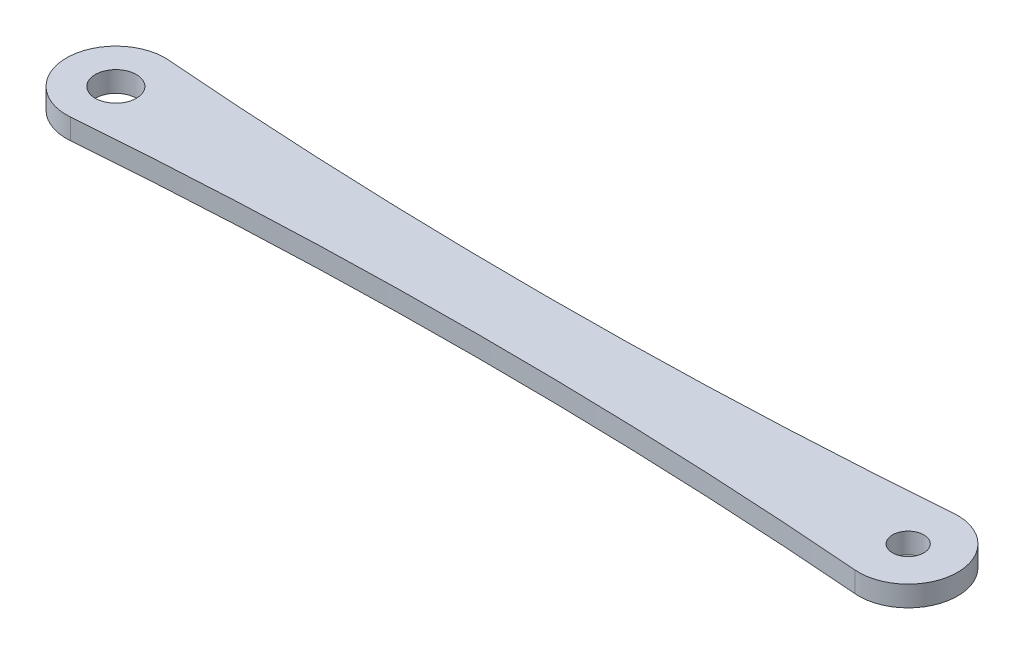
ISO-10303-21;
HEADER;
FILE_DESCRIPTION(('STEP AP214'),'2;1');
FILE_NAME('part.step','',(''),(''),'','','');
FILE_SCHEMA(('AUTOMOTIVE_DESIGN { 1 0 10303 214 1 1 1 1 }'));
ENDSEC;
DATA;
#1=APPLICATION_CONTEXT('core data for automotive mechanical design processes');
#2=APPLICATION_PROTOCOL_DEFINITION('international standard','automotive_design',2000,#1);
#3=PRODUCT_CONTEXT('',#1,'mechanical');
#4=PRODUCT('Part','Part','',(#3));
#5=PRODUCT_RELATED_PRODUCT_CATEGORY('part','',(#4));
#6=PRODUCT_DEFINITION_FORMATION('','',#4);
#7=PRODUCT_DEFINITION_CONTEXT('part definition',#1,'design');
#8=PRODUCT_DEFINITION('design','',#6,#7);
#9=PRODUCT_DEFINITION_SHAPE('','',#8);
#10=(LENGTH_UNIT() NAMED_UNIT(*) SI_UNIT(.MILLI.,.METRE.));
#11=(NAMED_UNIT(*) PLANE_ANGLE_UNIT() SI_UNIT($,.RADIAN.));
#12=(NAMED_UNIT(*) SI_UNIT($,.STERADIAN.) SOLID_ANGLE_UNIT());
#13=UNCERTAINTY_MEASURE_WITH_UNIT(LENGTH_MEASURE(1.E-05),#10,'distance_accuracy_value','');
#14=(GEOMETRIC_REPRESENTATION_CONTEXT(3) GLOBAL_UNCERTAINTY_ASSIGNED_CONTEXT((#13)) GLOBAL_UNIT_ASSIGNED_CONTEXT((#10,
#11,#12)) REPRESENTATION_CONTEXT('',''));
#15=CARTESIAN_POINT('',(0.,0.,0.));
#16=DIRECTION('',(0.,0.,1.));
#17=DIRECTION('',(1.,0.,0.));
#18=AXIS2_PLACEMENT_3D('',#15,#16,#17);
#19=CARTESIAN_POINT('',(122.28780978,3.175,0.));
#20=DIRECTION('',(0.,-1.,0.));
#21=DIRECTION('',(0.,0.,-1.));
#22=AXIS2_PLACEMENT_3D('',#19,#20,#21);
#23=CYLINDRICAL_SURFACE('',#22,7.62000000000001);
#24=CARTESIAN_POINT('',(122.28780978,0.,0.));
#25=DIRECTION('',(0.,1.,0.));
#26=DIRECTION('',(0.,0.,1.));
#27=AXIS2_PLACEMENT_3D('',#24,#25,#26);
#28=CIRCLE('',#27,7.62000000000001);
#29=CARTESIAN_POINT('',(121.682424583069,0.,7.59591395181234));
#30=VERTEX_POINT('',#29);
#31=CARTESIAN_POINT('',(121.682424583069,0.,-7.59591395181234));
#32=VERTEX_POINT('',#31);
#33=EDGE_CURVE('E120',#30,#32,#28,.T.);
#34=ORIENTED_EDGE('',*,*,#33,.T.);
#35=DIRECTION('',(0.,-1.,0.));
#36=VECTOR('',#35,1.);
#37=CARTESIAN_POINT('',(121.682424583069,3.175,-7.59591395181234));
#38=LINE('',#37,#36);
#39=CARTESIAN_POINT('',(121.682424583069,3.175,-7.59591395181234));
#40=VERTEX_POINT('',#39);
#41=EDGE_CURVE('E11',#40,#32,#38,.T.);
#42=ORIENTED_EDGE('',*,*,#41,.F.);
#43=CARTESIAN_POINT('',(122.28780978,3.175,0.));
#44=DIRECTION('',(0.,1.,0.));
#45=DIRECTION('',(0.,0.,1.));
#46=AXIS2_PLACEMENT_3D('',#43,#44,#45);
#47=CIRCLE('',#46,7.62000000000001);
#48=CARTESIAN_POINT('',(121.682424583069,3.175,7.59591395181234));
#49=VERTEX_POINT('',#48);
#50=EDGE_CURVE('E84',#49,#40,#47,.T.);
#51=ORIENTED_EDGE('',*,*,#50,.F.);
#52=DIRECTION('',(0.,-1.,0.));
#53=VECTOR('',#52,1.);
#54=CARTESIAN_POINT('',(121.682424583069,3.175,7.59591395181234));
#55=LINE('',#54,#53);
#56=EDGE_CURVE('E119',#49,#30,#55,.T.);
#57=ORIENTED_EDGE('',*,*,#56,.T.);
#58=EDGE_LOOP('',(#34,#42,#51,#57));
#59=FACE_BOUND('',#58,.T.);
#60=ADVANCED_FACE('F41',(#59),#23,.T.);
#61=CARTESIAN_POINT('',(61.14390489,3.175,-767.187309133045));
#62=DIRECTION('',(0.,-1.,0.));
#63=DIRECTION('',(0.,0.,-1.));
#64=AXIS2_PLACEMENT_3D('',#61,#62,#63);
#65=CYLINDRICAL_SURFACE('',#64,762.);
#66=CARTESIAN_POINT('',(61.14390489,0.,-767.187309133045));
#67=DIRECTION('',(0.,1.,0.));
#68=DIRECTION('',(0.,0.,1.));
#69=AXIS2_PLACEMENT_3D('',#66,#67,#68);
#70=CIRCLE('',#69,762.);
#71=CARTESIAN_POINT('',(0.605385196930693,0.,-7.59591395181233));
#72=VERTEX_POINT('',#71);
#73=EDGE_CURVE('E94',#72,#32,#70,.T.);
#74=ORIENTED_EDGE('',*,*,#73,.F.);
#75=DIRECTION('',(0.,-1.,0.));
#76=VECTOR('',#75,1.);
#77=CARTESIAN_POINT('',(0.605385196930693,3.175,-7.59591395181233));
#78=LINE('',#77,#76);
#79=CARTESIAN_POINT('',(0.605385196930693,3.175,-7.59591395181233));
#80=VERTEX_POINT('',#79);
#81=EDGE_CURVE('E50',#80,#72,#78,.T.);
#82=ORIENTED_EDGE('',*,*,#81,.F.);
#83=CARTESIAN_POINT('',(61.14390489,3.175,-767.187309133045));
#84=DIRECTION('',(0.,1.,0.));
#85=DIRECTION('',(0.,0.,1.));
#86=AXIS2_PLACEMENT_3D('',#83,#84,#85);
#87=CIRCLE('',#86,762.);
#88=EDGE_CURVE('E92',#80,#40,#87,.T.);
#89=ORIENTED_EDGE('',*,*,#88,.T.);
#90=ORIENTED_EDGE('',*,*,#41,.T.);
#91=EDGE_LOOP('',(#74,#82,#89,#90));
#92=FACE_BOUND('',#91,.T.);
#93=ADVANCED_FACE('F91',(#92),#65,.F.);
#94=CARTESIAN_POINT('',(0.,3.175,0.));
#95=DIRECTION('',(0.,-1.,0.));
#96=DIRECTION('',(0.,0.,-1.));
#97=AXIS2_PLACEMENT_3D('',#94,#95,#96);
#98=CYLINDRICAL_SURFACE('',#97,7.62);
#99=CARTESIAN_POINT('',(0.,0.,0.));
#100=DIRECTION('',(0.,1.,0.));
#101=DIRECTION('',(0.,0.,1.));
#102=AXIS2_PLACEMENT_3D('',#99,#100,#101);
#103=CIRCLE('',#102,7.62);
#104=CARTESIAN_POINT('',(0.605385196930693,0.,7.59591395181233));
#105=VERTEX_POINT('',#104);
#106=EDGE_CURVE('E73',#72,#105,#103,.T.);
#107=ORIENTED_EDGE('',*,*,#106,.T.);
#108=DIRECTION('',(0.,-1.,0.));
#109=VECTOR('',#108,1.);
#110=CARTESIAN_POINT('',(0.605385196930693,3.175,7.59591395181233));
#111=LINE('',#110,#109);
#112=CARTESIAN_POINT('',(0.605385196930693,3.175,7.59591395181233));
#113=VERTEX_POINT('',#112);
#114=EDGE_CURVE('E96',#113,#105,#111,.T.);
#115=ORIENTED_EDGE('',*,*,#114,.F.);
#116=CARTESIAN_POINT('',(0.,3.175,0.));
#117=DIRECTION('',(0.,1.,0.));
#118=DIRECTION('',(0.,0.,1.));
#119=AXIS2_PLACEMENT_3D('',#116,#117,#118);
#120=CIRCLE('',#119,7.62);
#121=EDGE_CURVE('E97',#80,#113,#120,.T.);
#122=ORIENTED_EDGE('',*,*,#121,.F.);
#123=ORIENTED_EDGE('',*,*,#81,.T.);
#124=EDGE_LOOP('',(#107,#115,#122,#123));
#125=FACE_BOUND('',#124,.T.);
#126=ADVANCED_FACE('F98',(#125),#98,.T.);
#127=CARTESIAN_POINT('',(0.,3.175,0.));
#128=DIRECTION('',(0.,-1.,0.));
#129=DIRECTION('',(0.,0.,-1.));
#130=AXIS2_PLACEMENT_3D('',#127,#128,#129);
#131=CYLINDRICAL_SURFACE('',#130,3.175);
#132=CARTESIAN_POINT('',(0.,3.175,0.));
#133=DIRECTION('',(0.,1.,0.));
#134=DIRECTION('',(0.,0.,1.));
#135=AXIS2_PLACEMENT_3D('',#132,#133,#134);
#136=CIRCLE('',#135,3.175);
#137=CARTESIAN_POINT('',(0.,3.175,3.175));
#138=VERTEX_POINT('',#137);
#139=EDGE_CURVE('E111',#138,#138,#136,.T.);
#140=ORIENTED_EDGE('',*,*,#139,.T.);
#141=EDGE_LOOP('',(#140));
#142=FACE_BOUND('',#141,.T.);
#143=CARTESIAN_POINT('',(0.,0.,0.));
#144=DIRECTION('',(0.,1.,0.));
#145=DIRECTION('',(0.,0.,1.));
#146=AXIS2_PLACEMENT_3D('',#143,#144,#145);
#147=CIRCLE('',#146,3.175);
#148=CARTESIAN_POINT('',(0.,0.,3.175));
#149=VERTEX_POINT('',#148);
#150=EDGE_CURVE('E130',#149,#149,#147,.T.);
#151=ORIENTED_EDGE('',*,*,#150,.F.);
#152=EDGE_LOOP('',(#151));
#153=FACE_BOUND('',#152,.T.);
#154=ADVANCED_FACE('F153',(#142,#153),#131,.F.);
#155=CARTESIAN_POINT('',(61.14390489,3.175,767.187309133045));
#156=DIRECTION('',(0.,-1.,0.));
#157=DIRECTION('',(0.,0.,-1.));
#158=AXIS2_PLACEMENT_3D('',#155,#156,#157);
#159=CYLINDRICAL_SURFACE('',#158,762.);
#160=CARTESIAN_POINT('',(61.14390489,0.,767.187309133045));
#161=DIRECTION('',(0.,1.,0.));
#162=DIRECTION('',(0.,0.,1.));
#163=AXIS2_PLACEMENT_3D('',#160,#161,#162);
#164=CIRCLE('',#163,762.);
#165=EDGE_CURVE('E79',#105,#30,#164,.F.);
#166=ORIENTED_EDGE('',*,*,#165,.T.);
#167=ORIENTED_EDGE('',*,*,#56,.F.);
#168=CARTESIAN_POINT('',(61.14390489,3.175,767.187309133045));
#169=DIRECTION('',(0.,1.,0.));
#170=DIRECTION('',(0.,0.,1.));
#171=AXIS2_PLACEMENT_3D('',#168,#169,#170);
#172=CIRCLE('',#171,762.);
#173=EDGE_CURVE('E58',#113,#49,#172,.F.);
#174=ORIENTED_EDGE('',*,*,#173,.F.);
#175=ORIENTED_EDGE('',*,*,#114,.T.);
#176=EDGE_LOOP('',(#166,#167,#174,#175));
#177=FACE_BOUND('',#176,.T.);
#178=ADVANCED_FACE('F140',(#177),#159,.F.);
#179=CARTESIAN_POINT('',(122.28780978,3.175,0.));
#180=DIRECTION('',(0.,-1.,0.));
#181=DIRECTION('',(0.,0.,-1.));
#182=AXIS2_PLACEMENT_3D('',#179,#180,#181);
#183=CYLINDRICAL_SURFACE('',#182,2.413);
#184=CARTESIAN_POINT('',(122.28780978,3.175,0.));
#185=DIRECTION('',(0.,1.,0.));
#186=DIRECTION('',(0.,0.,1.));
#187=AXIS2_PLACEMENT_3D('',#184,#185,#186);
#188=CIRCLE('',#187,2.413);
#189=CARTESIAN_POINT('',(122.28780978,3.175,2.413));
#190=VERTEX_POINT('',#189);
#191=EDGE_CURVE('E115',#190,#190,#188,.T.);
#192=ORIENTED_EDGE('',*,*,#191,.T.);
#193=EDGE_LOOP('',(#192));
#194=FACE_BOUND('',#193,.T.);
#195=CARTESIAN_POINT('',(122.28780978,0.,0.));
#196=DIRECTION('',(0.,1.,0.));
#197=DIRECTION('',(0.,0.,1.));
#198=AXIS2_PLACEMENT_3D('',#195,#196,#197);
#199=CIRCLE('',#198,2.413);
#200=CARTESIAN_POINT('',(122.28780978,0.,2.413));
#201=VERTEX_POINT('',#200);
#202=EDGE_CURVE('E106',#201,#201,#199,.T.);
#203=ORIENTED_EDGE('',*,*,#202,.F.);
#204=EDGE_LOOP('',(#203));
#205=FACE_BOUND('',#204,.T.);
#206=ADVANCED_FACE('F158',(#194,#205),#183,.F.);
#207=CARTESIAN_POINT('',(0.,3.175,0.));
#208=DIRECTION('',(0.,1.,0.));
#209=DIRECTION('',(0.,0.,1.));
#210=AXIS2_PLACEMENT_3D('',#207,#208,#209);
#211=PLANE('',#210);
#212=ORIENTED_EDGE('',*,*,#50,.T.);
#213=ORIENTED_EDGE('',*,*,#88,.F.);
#214=ORIENTED_EDGE('',*,*,#121,.T.);
#215=ORIENTED_EDGE('',*,*,#173,.T.);
#216=EDGE_LOOP('',(#212,#213,#214,#215));
#217=FACE_BOUND('',#216,.T.);
#218=ORIENTED_EDGE('',*,*,#139,.F.);
#219=EDGE_LOOP('',(#218));
#220=FACE_BOUND('',#219,.T.);
#221=ORIENTED_EDGE('',*,*,#191,.F.);
#222=EDGE_LOOP('',(#221));
#223=FACE_BOUND('',#222,.T.);
#224=ADVANCED_FACE('F101',(#217,#220,#223),#211,.T.);
#225=CARTESIAN_POINT('',(0.,0.,0.));
#226=DIRECTION('',(0.,1.,0.));
#227=DIRECTION('',(0.,0.,1.));
#228=AXIS2_PLACEMENT_3D('',#225,#226,#227);
#229=PLANE('',#228);
#230=ORIENTED_EDGE('',*,*,#33,.F.);
#231=ORIENTED_EDGE('',*,*,#165,.F.);
#232=ORIENTED_EDGE('',*,*,#106,.F.);
#233=ORIENTED_EDGE('',*,*,#73,.T.);
#234=EDGE_LOOP('',(#230,#231,#232,#233));
#235=FACE_BOUND('',#234,.T.);
#236=ORIENTED_EDGE('',*,*,#150,.T.);
#237=EDGE_LOOP('',(#236));
#238=FACE_BOUND('',#237,.T.);
#239=ORIENTED_EDGE('',*,*,#202,.T.);
#240=EDGE_LOOP('',(#239));
#241=FACE_BOUND('',#240,.T.);
#242=ADVANCED_FACE('F143',(#235,#238,#241),#229,.F.);
#243=CLOSED_SHELL('',(#60,#93,#126,#154,#178,#206,#224,#242));
#244=MANIFOLD_SOLID_BREP('B2',#243);
#245=ADVANCED_BREP_SHAPE_REPRESENTATION('',(#18,#244),#14);
#246=SHAPE_DEFINITION_REPRESENTATION(#9,#245);
ENDSEC;
END-ISO-10303-21;
